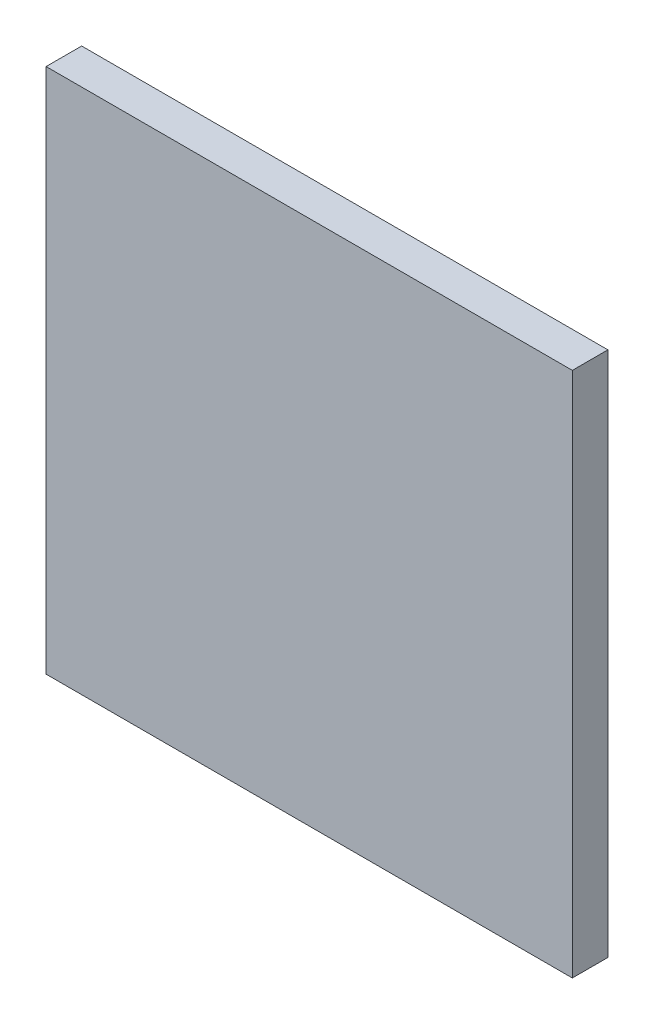
ISO-10303-21;
HEADER;
FILE_DESCRIPTION(('STEP AP214'),'2;1');
FILE_NAME('part.step','',(''),(''),'','','');
FILE_SCHEMA(('AUTOMOTIVE_DESIGN { 1 0 10303 214 1 1 1 1 }'));
ENDSEC;
DATA;
#1=APPLICATION_CONTEXT('core data for automotive mechanical design processes');
#2=APPLICATION_PROTOCOL_DEFINITION('international standard','automotive_design',2000,#1);
#3=PRODUCT_CONTEXT('',#1,'mechanical');
#4=PRODUCT('Part','Part','',(#3));
#5=PRODUCT_RELATED_PRODUCT_CATEGORY('part','',(#4));
#6=PRODUCT_DEFINITION_FORMATION('','',#4);
#7=PRODUCT_DEFINITION_CONTEXT('part definition',#1,'design');
#8=PRODUCT_DEFINITION('design','',#6,#7);
#9=PRODUCT_DEFINITION_SHAPE('','',#8);
#10=(LENGTH_UNIT() NAMED_UNIT(*) SI_UNIT(.MILLI.,.METRE.));
#11=(NAMED_UNIT(*) PLANE_ANGLE_UNIT() SI_UNIT($,.RADIAN.));
#12=(NAMED_UNIT(*) SI_UNIT($,.STERADIAN.) SOLID_ANGLE_UNIT());
#13=UNCERTAINTY_MEASURE_WITH_UNIT(LENGTH_MEASURE(1.E-05),#10,'distance_accuracy_value','');
#14=(GEOMETRIC_REPRESENTATION_CONTEXT(3) GLOBAL_UNCERTAINTY_ASSIGNED_CONTEXT((#13)) GLOBAL_UNIT_ASSIGNED_CONTEXT((#10,
#11,#12)) REPRESENTATION_CONTEXT('',''));
#15=CARTESIAN_POINT('',(0.,0.,0.));
#16=DIRECTION('',(0.,0.,1.));
#17=DIRECTION('',(1.,0.,0.));
#18=AXIS2_PLACEMENT_3D('',#15,#16,#17);
#19=CARTESIAN_POINT('',(605.123437974677,694.281976166603,25.));
#20=DIRECTION('',(0.,1.,0.));
#21=DIRECTION('',(0.,0.,1.));
#22=AXIS2_PLACEMENT_3D('',#19,#20,#21);
#23=PLANE('',#22);
#24=DIRECTION('',(1.,0.,0.));
#25=VECTOR('',#24,1.);
#26=CARTESIAN_POINT('',(605.123437974677,694.281976166603,0.));
#27=LINE('',#26,#25);
#28=CARTESIAN_POINT('',(605.123437974677,694.281976166603,0.));
#29=VERTEX_POINT('',#28);
#30=CARTESIAN_POINT('',(975.123437974677,694.281976166603,0.));
#31=VERTEX_POINT('',#30);
#32=EDGE_CURVE('E100',#29,#31,#27,.T.);
#33=ORIENTED_EDGE('',*,*,#32,.F.);
#34=DIRECTION('',(0.,0.,-1.));
#35=VECTOR('',#34,1.);
#36=CARTESIAN_POINT('',(605.123437974677,694.281976166603,25.));
#37=LINE('',#36,#35);
#38=CARTESIAN_POINT('',(605.123437974677,694.281976166603,25.));
#39=VERTEX_POINT('',#38);
#40=EDGE_CURVE('E11',#39,#29,#37,.T.);
#41=ORIENTED_EDGE('',*,*,#40,.F.);
#42=DIRECTION('',(1.,0.,0.));
#43=VECTOR('',#42,1.);
#44=CARTESIAN_POINT('',(605.123437974677,694.281976166603,25.));
#45=LINE('',#44,#43);
#46=CARTESIAN_POINT('',(975.123437974677,694.281976166603,25.));
#47=VERTEX_POINT('',#46);
#48=EDGE_CURVE('E94',#39,#47,#45,.T.);
#49=ORIENTED_EDGE('',*,*,#48,.T.);
#50=DIRECTION('',(0.,0.,-1.));
#51=VECTOR('',#50,1.);
#52=CARTESIAN_POINT('',(975.123437974677,694.281976166603,25.));
#53=LINE('',#52,#51);
#54=EDGE_CURVE('E39',#47,#31,#53,.T.);
#55=ORIENTED_EDGE('',*,*,#54,.T.);
#56=EDGE_LOOP('',(#33,#41,#49,#55));
#57=FACE_BOUND('',#56,.T.);
#58=ADVANCED_FACE('F36',(#57),#23,.T.);
#59=CARTESIAN_POINT('',(605.123437974677,324.281976166603,25.));
#60=DIRECTION('',(-1.,0.,0.));
#61=DIRECTION('',(0.,0.,1.));
#62=AXIS2_PLACEMENT_3D('',#59,#60,#61);
#63=PLANE('',#62);
#64=DIRECTION('',(0.,1.,0.));
#65=VECTOR('',#64,1.);
#66=CARTESIAN_POINT('',(605.123437974677,324.281976166603,0.));
#67=LINE('',#66,#65);
#68=CARTESIAN_POINT('',(605.123437974677,324.281976166603,0.));
#69=VERTEX_POINT('',#68);
#70=EDGE_CURVE('E96',#69,#29,#67,.T.);
#71=ORIENTED_EDGE('',*,*,#70,.F.);
#72=DIRECTION('',(0.,0.,-1.));
#73=VECTOR('',#72,1.);
#74=CARTESIAN_POINT('',(605.123437974677,324.281976166603,25.));
#75=LINE('',#74,#73);
#76=CARTESIAN_POINT('',(605.123437974677,324.281976166603,25.));
#77=VERTEX_POINT('',#76);
#78=EDGE_CURVE('E45',#77,#69,#75,.T.);
#79=ORIENTED_EDGE('',*,*,#78,.F.);
#80=DIRECTION('',(0.,1.,0.));
#81=VECTOR('',#80,1.);
#82=CARTESIAN_POINT('',(605.123437974677,324.281976166603,25.));
#83=LINE('',#82,#81);
#84=EDGE_CURVE('E91',#77,#39,#83,.T.);
#85=ORIENTED_EDGE('',*,*,#84,.T.);
#86=ORIENTED_EDGE('',*,*,#40,.T.);
#87=EDGE_LOOP('',(#71,#79,#85,#86));
#88=FACE_BOUND('',#87,.T.);
#89=ADVANCED_FACE('F110',(#88),#63,.T.);
#90=CARTESIAN_POINT('',(975.123437974677,324.281976166603,25.));
#91=DIRECTION('',(0.,-1.,0.));
#92=DIRECTION('',(1.,0.,0.));
#93=AXIS2_PLACEMENT_3D('',#90,#91,#92);
#94=PLANE('',#93);
#95=DIRECTION('',(-1.,0.,0.));
#96=VECTOR('',#95,1.);
#97=CARTESIAN_POINT('',(975.123437974677,324.281976166603,0.));
#98=LINE('',#97,#96);
#99=CARTESIAN_POINT('',(975.123437974677,324.281976166603,0.));
#100=VERTEX_POINT('',#99);
#101=EDGE_CURVE('E86',#100,#69,#98,.T.);
#102=ORIENTED_EDGE('',*,*,#101,.F.);
#103=DIRECTION('',(0.,0.,-1.));
#104=VECTOR('',#103,1.);
#105=CARTESIAN_POINT('',(975.123437974677,324.281976166603,25.));
#106=LINE('',#105,#104);
#107=CARTESIAN_POINT('',(975.123437974677,324.281976166603,25.));
#108=VERTEX_POINT('',#107);
#109=EDGE_CURVE('E81',#108,#100,#106,.T.);
#110=ORIENTED_EDGE('',*,*,#109,.F.);
#111=DIRECTION('',(-1.,0.,0.));
#112=VECTOR('',#111,1.);
#113=CARTESIAN_POINT('',(975.123437974677,324.281976166603,25.));
#114=LINE('',#113,#112);
#115=EDGE_CURVE('E84',#108,#77,#114,.T.);
#116=ORIENTED_EDGE('',*,*,#115,.T.);
#117=ORIENTED_EDGE('',*,*,#78,.T.);
#118=EDGE_LOOP('',(#102,#110,#116,#117));
#119=FACE_BOUND('',#118,.T.);
#120=ADVANCED_FACE('F83',(#119),#94,.T.);
#121=CARTESIAN_POINT('',(975.123437974677,694.281976166603,25.));
#122=DIRECTION('',(1.,0.,0.));
#123=DIRECTION('',(0.,1.,0.));
#124=AXIS2_PLACEMENT_3D('',#121,#122,#123);
#125=PLANE('',#124);
#126=DIRECTION('',(0.,-1.,0.));
#127=VECTOR('',#126,1.);
#128=CARTESIAN_POINT('',(975.123437974677,694.281976166603,0.));
#129=LINE('',#128,#127);
#130=EDGE_CURVE('E103',#31,#100,#129,.T.);
#131=ORIENTED_EDGE('',*,*,#130,.F.);
#132=ORIENTED_EDGE('',*,*,#54,.F.);
#133=DIRECTION('',(0.,-1.,0.));
#134=VECTOR('',#133,1.);
#135=CARTESIAN_POINT('',(975.123437974677,694.281976166603,25.));
#136=LINE('',#135,#134);
#137=EDGE_CURVE('E90',#47,#108,#136,.T.);
#138=ORIENTED_EDGE('',*,*,#137,.T.);
#139=ORIENTED_EDGE('',*,*,#109,.T.);
#140=EDGE_LOOP('',(#131,#132,#138,#139));
#141=FACE_BOUND('',#140,.T.);
#142=ADVANCED_FACE('F93',(#141),#125,.T.);
#143=CARTESIAN_POINT('',(0.,0.,25.));
#144=DIRECTION('',(0.,0.,-1.));
#145=DIRECTION('',(-1.,0.,0.));
#146=AXIS2_PLACEMENT_3D('',#143,#144,#145);
#147=PLANE('',#146);
#148=ORIENTED_EDGE('',*,*,#48,.F.);
#149=ORIENTED_EDGE('',*,*,#84,.F.);
#150=ORIENTED_EDGE('',*,*,#115,.F.);
#151=ORIENTED_EDGE('',*,*,#137,.F.);
#152=EDGE_LOOP('',(#148,#149,#150,#151));
#153=FACE_BOUND('',#152,.T.);
#154=ADVANCED_FACE('F89',(#153),#147,.F.);
#155=CARTESIAN_POINT('',(0.,0.,0.));
#156=DIRECTION('',(0.,0.,-1.));
#157=DIRECTION('',(-1.,0.,0.));
#158=AXIS2_PLACEMENT_3D('',#155,#156,#157);
#159=PLANE('',#158);
#160=ORIENTED_EDGE('',*,*,#32,.T.);
#161=ORIENTED_EDGE('',*,*,#130,.T.);
#162=ORIENTED_EDGE('',*,*,#101,.T.);
#163=ORIENTED_EDGE('',*,*,#70,.T.);
#164=EDGE_LOOP('',(#160,#161,#162,#163));
#165=FACE_BOUND('',#164,.T.);
#166=ADVANCED_FACE('F109',(#165),#159,.T.);
#167=CLOSED_SHELL('',(#58,#89,#120,#142,#154,#166));
#168=MANIFOLD_SOLID_BREP('B2',#167);
#169=ADVANCED_BREP_SHAPE_REPRESENTATION('',(#18,#168),#14);
#170=SHAPE_DEFINITION_REPRESENTATION(#9,#169);
ENDSEC;
END-ISO-10303-21;
